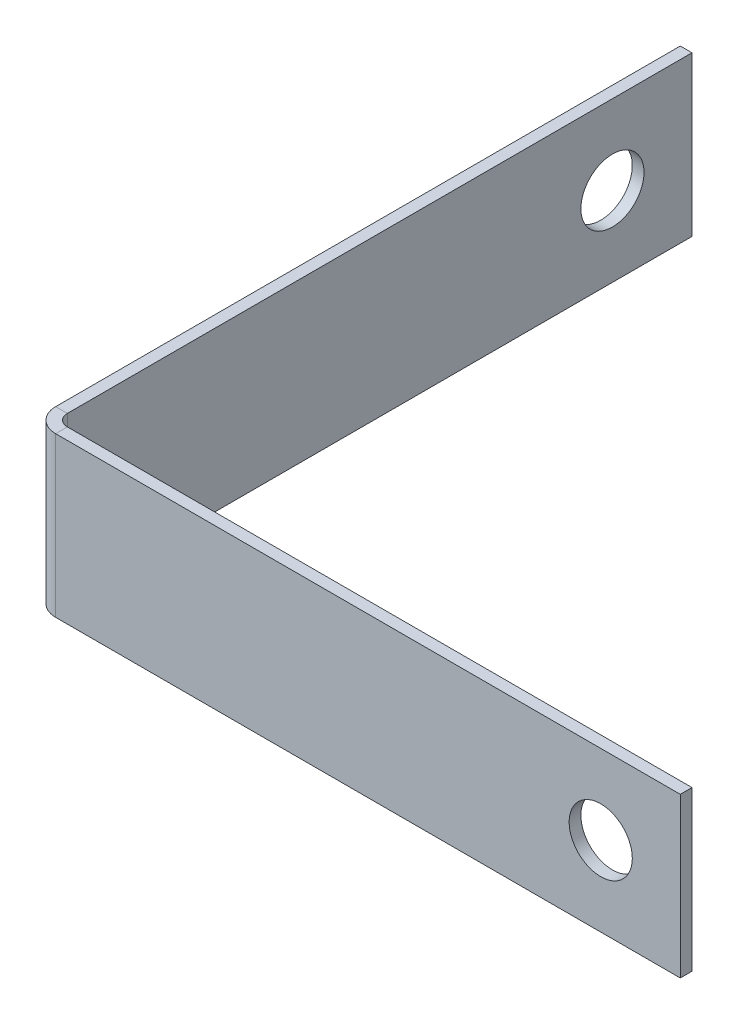
ISO-10303-21;
HEADER;
FILE_DESCRIPTION(('STEP AP214'),'2;1');
FILE_NAME('part.step','',(''),(''),'','','');
FILE_SCHEMA(('AUTOMOTIVE_DESIGN { 1 0 10303 214 1 1 1 1 }'));
ENDSEC;
DATA;
#1=APPLICATION_CONTEXT('core data for automotive mechanical design processes');
#2=APPLICATION_PROTOCOL_DEFINITION('international standard','automotive_design',2000,#1);
#3=PRODUCT_CONTEXT('',#1,'mechanical');
#4=PRODUCT('Part','Part','',(#3));
#5=PRODUCT_RELATED_PRODUCT_CATEGORY('part','',(#4));
#6=PRODUCT_DEFINITION_FORMATION('','',#4);
#7=PRODUCT_DEFINITION_CONTEXT('part definition',#1,'design');
#8=PRODUCT_DEFINITION('design','',#6,#7);
#9=PRODUCT_DEFINITION_SHAPE('','',#8);
#10=(LENGTH_UNIT() NAMED_UNIT(*) SI_UNIT(.MILLI.,.METRE.));
#11=(NAMED_UNIT(*) PLANE_ANGLE_UNIT() SI_UNIT($,.RADIAN.));
#12=(NAMED_UNIT(*) SI_UNIT($,.STERADIAN.) SOLID_ANGLE_UNIT());
#13=UNCERTAINTY_MEASURE_WITH_UNIT(LENGTH_MEASURE(1.E-05),#10,'distance_accuracy_value','');
#14=(GEOMETRIC_REPRESENTATION_CONTEXT(3) GLOBAL_UNCERTAINTY_ASSIGNED_CONTEXT((#13)) GLOBAL_UNIT_ASSIGNED_CONTEXT((#10,
#11,#12)) REPRESENTATION_CONTEXT('',''));
#15=CARTESIAN_POINT('',(0.,0.,0.));
#16=DIRECTION('',(0.,0.,1.));
#17=DIRECTION('',(1.,0.,0.));
#18=AXIS2_PLACEMENT_3D('',#15,#16,#17);
#19=CARTESIAN_POINT('',(0.736600000000004,10.,0.));
#20=DIRECTION('',(0.,1.,0.));
#21=DIRECTION('',(0.,0.,1.));
#22=AXIS2_PLACEMENT_3D('',#19,#20,#21);
#23=PLANE('',#22);
#24=DIRECTION('',(0.,0.,1.));
#25=VECTOR('',#24,1.);
#26=CARTESIAN_POINT('',(0.736600000000004,10.,0.));
#27=LINE('',#26,#25);
#28=CARTESIAN_POINT('',(0.736600000000004,10.,0.));
#29=VERTEX_POINT('',#28);
#30=CARTESIAN_POINT('',(0.736600000000004,10.,0.736600000000004));
#31=VERTEX_POINT('',#30);
#32=EDGE_CURVE('E11',#29,#31,#27,.T.);
#33=ORIENTED_EDGE('',*,*,#32,.F.);
#34=CARTESIAN_POINT('',(0.736600000000004,10.,-0.736600000000004));
#35=DIRECTION('',(0.,-1.,0.));
#36=DIRECTION('',(0.,0.,-1.));
#37=AXIS2_PLACEMENT_3D('',#34,#35,#36);
#38=CIRCLE('',#37,0.7366);
#39=CARTESIAN_POINT('',(0.,10.,-0.736600000000004));
#40=VERTEX_POINT('',#39);
#41=EDGE_CURVE('E136',#40,#29,#38,.F.);
#42=ORIENTED_EDGE('',*,*,#41,.F.);
#43=DIRECTION('',(1.,0.,0.));
#44=VECTOR('',#43,1.);
#45=CARTESIAN_POINT('',(-0.736600000000004,10.,-0.736600000000004));
#46=LINE('',#45,#44);
#47=CARTESIAN_POINT('',(-0.736600000000004,10.,-0.736600000000004));
#48=VERTEX_POINT('',#47);
#49=EDGE_CURVE('E47',#48,#40,#46,.T.);
#50=ORIENTED_EDGE('',*,*,#49,.F.);
#51=CARTESIAN_POINT('',(0.736600000000004,10.,-0.736600000000004));
#52=DIRECTION('',(0.,1.,0.));
#53=DIRECTION('',(1.,0.,0.));
#54=AXIS2_PLACEMENT_3D('',#51,#52,#53);
#55=CIRCLE('',#54,1.4732);
#56=EDGE_CURVE('E129',#48,#31,#55,.T.);
#57=ORIENTED_EDGE('',*,*,#56,.T.);
#58=EDGE_LOOP('',(#33,#42,#50,#57));
#59=FACE_BOUND('',#58,.T.);
#60=ADVANCED_FACE('F38',(#59),#23,.T.);
#61=CARTESIAN_POINT('',(-0.736600000000004,10.,-0.736600000000004));
#62=DIRECTION('',(0.,1.,0.));
#63=DIRECTION('',(0.,0.,1.));
#64=AXIS2_PLACEMENT_3D('',#61,#62,#63);
#65=PLANE('',#64);
#66=DIRECTION('',(1.,0.,0.));
#67=VECTOR('',#66,1.);
#68=CARTESIAN_POINT('',(0.,10.,0.));
#69=LINE('',#68,#67);
#70=CARTESIAN_POINT('',(40.,10.,0.));
#71=VERTEX_POINT('',#70);
#72=EDGE_CURVE('E186',#29,#71,#69,.T.);
#73=ORIENTED_EDGE('',*,*,#72,.F.);
#74=ORIENTED_EDGE('',*,*,#32,.T.);
#75=DIRECTION('',(1.,0.,0.));
#76=VECTOR('',#75,1.);
#77=CARTESIAN_POINT('',(0.,10.,0.736600000000004));
#78=LINE('',#77,#76);
#79=CARTESIAN_POINT('',(40.,10.,0.736600000000004));
#80=VERTEX_POINT('',#79);
#81=EDGE_CURVE('E95',#31,#80,#78,.T.);
#82=ORIENTED_EDGE('',*,*,#81,.T.);
#83=DIRECTION('',(0.,0.,1.));
#84=VECTOR('',#83,1.);
#85=CARTESIAN_POINT('',(40.,10.,0.));
#86=LINE('',#85,#84);
#87=EDGE_CURVE('E380',#71,#80,#86,.T.);
#88=ORIENTED_EDGE('',*,*,#87,.F.);
#89=EDGE_LOOP('',(#73,#74,#82,#88));
#90=FACE_BOUND('',#89,.T.);
#91=ADVANCED_FACE('F194',(#90),#65,.T.);
#92=CARTESIAN_POINT('',(0.,0.,-0.736600000000004));
#93=DIRECTION('',(0.,-1.,0.));
#94=DIRECTION('',(0.,0.,-1.));
#95=AXIS2_PLACEMENT_3D('',#92,#93,#94);
#96=PLANE('',#95);
#97=DIRECTION('',(-1.,0.,0.));
#98=VECTOR('',#97,1.);
#99=CARTESIAN_POINT('',(0.,0.,-0.736600000000004));
#100=LINE('',#99,#98);
#101=CARTESIAN_POINT('',(0.,0.,-0.736600000000004));
#102=VERTEX_POINT('',#101);
#103=CARTESIAN_POINT('',(-0.736600000000004,0.,-0.736600000000004));
#104=VERTEX_POINT('',#103);
#105=EDGE_CURVE('E82',#102,#104,#100,.T.);
#106=ORIENTED_EDGE('',*,*,#105,.F.);
#107=CARTESIAN_POINT('',(0.736600000000004,0.,-0.736600000000004));
#108=DIRECTION('',(0.,-1.,0.));
#109=DIRECTION('',(0.,0.,-1.));
#110=AXIS2_PLACEMENT_3D('',#107,#108,#109);
#111=CIRCLE('',#110,0.7366);
#112=CARTESIAN_POINT('',(0.736600000000004,0.,0.));
#113=VERTEX_POINT('',#112);
#114=EDGE_CURVE('E151',#102,#113,#111,.F.);
#115=ORIENTED_EDGE('',*,*,#114,.T.);
#116=DIRECTION('',(0.,0.,-1.));
#117=VECTOR('',#116,1.);
#118=CARTESIAN_POINT('',(0.736600000000004,0.,0.736600000000004));
#119=LINE('',#118,#117);
#120=CARTESIAN_POINT('',(0.736600000000004,0.,0.736600000000004));
#121=VERTEX_POINT('',#120);
#122=EDGE_CURVE('E89',#121,#113,#119,.T.);
#123=ORIENTED_EDGE('',*,*,#122,.F.);
#124=CARTESIAN_POINT('',(0.736600000000004,0.,-0.736600000000004));
#125=DIRECTION('',(0.,1.,0.));
#126=DIRECTION('',(1.,0.,0.));
#127=AXIS2_PLACEMENT_3D('',#124,#125,#126);
#128=CIRCLE('',#127,1.4732);
#129=EDGE_CURVE('E158',#104,#121,#128,.T.);
#130=ORIENTED_EDGE('',*,*,#129,.F.);
#131=EDGE_LOOP('',(#106,#115,#123,#130));
#132=FACE_BOUND('',#131,.T.);
#133=ADVANCED_FACE('F192',(#132),#96,.T.);
#134=CARTESIAN_POINT('',(0.736600000000004,0.,0.736600000000004));
#135=DIRECTION('',(0.,-1.,0.));
#136=DIRECTION('',(0.,0.,-1.));
#137=AXIS2_PLACEMENT_3D('',#134,#135,#136);
#138=PLANE('',#137);
#139=DIRECTION('',(0.,0.,1.));
#140=VECTOR('',#139,1.);
#141=CARTESIAN_POINT('',(0.,0.,-40.));
#142=LINE('',#141,#140);
#143=CARTESIAN_POINT('',(0.,0.,-40.));
#144=VERTEX_POINT('',#143);
#145=EDGE_CURVE('E153',#144,#102,#142,.T.);
#146=ORIENTED_EDGE('',*,*,#145,.T.);
#147=ORIENTED_EDGE('',*,*,#105,.T.);
#148=DIRECTION('',(0.,0.,1.));
#149=VECTOR('',#148,1.);
#150=CARTESIAN_POINT('',(-0.736600000000004,0.,-40.));
#151=LINE('',#150,#149);
#152=CARTESIAN_POINT('',(-0.736600000000004,0.,-40.));
#153=VERTEX_POINT('',#152);
#154=EDGE_CURVE('E156',#153,#104,#151,.T.);
#155=ORIENTED_EDGE('',*,*,#154,.F.);
#156=DIRECTION('',(1.,0.,0.));
#157=VECTOR('',#156,1.);
#158=CARTESIAN_POINT('',(-0.736600000000004,0.,-40.));
#159=LINE('',#158,#157);
#160=EDGE_CURVE('E117',#153,#144,#159,.T.);
#161=ORIENTED_EDGE('',*,*,#160,.T.);
#162=EDGE_LOOP('',(#146,#147,#155,#161));
#163=FACE_BOUND('',#162,.T.);
#164=ADVANCED_FACE('F188',(#163),#138,.T.);
#165=CARTESIAN_POINT('',(0.,10.,0.736600000000004));
#166=DIRECTION('',(0.,0.,-1.));
#167=DIRECTION('',(-1.,0.,0.));
#168=AXIS2_PLACEMENT_3D('',#165,#166,#167);
#169=PLANE('',#168);
#170=CARTESIAN_POINT('',(35.,5.,0.736600000000004));
#171=DIRECTION('',(0.,0.,1.));
#172=DIRECTION('',(1.,0.,0.));
#173=AXIS2_PLACEMENT_3D('',#170,#171,#172);
#174=CIRCLE('',#173,1.984375);
#175=CARTESIAN_POINT('',(36.984375,5.,0.736600000000004));
#176=VERTEX_POINT('',#175);
#177=EDGE_CURVE('E374',#176,#176,#174,.T.);
#178=ORIENTED_EDGE('',*,*,#177,.F.);
#179=EDGE_LOOP('',(#178));
#180=FACE_BOUND('',#179,.T.);
#181=DIRECTION('',(1.,0.,0.));
#182=VECTOR('',#181,1.);
#183=CARTESIAN_POINT('',(0.,0.,0.736600000000004));
#184=LINE('',#183,#182);
#185=CARTESIAN_POINT('',(40.,0.,0.736600000000004));
#186=VERTEX_POINT('',#185);
#187=EDGE_CURVE('E142',#121,#186,#184,.T.);
#188=ORIENTED_EDGE('',*,*,#187,.T.);
#189=DIRECTION('',(0.,-1.,0.));
#190=VECTOR('',#189,1.);
#191=CARTESIAN_POINT('',(40.,10.,0.736600000000004));
#192=LINE('',#191,#190);
#193=EDGE_CURVE('E172',#80,#186,#192,.T.);
#194=ORIENTED_EDGE('',*,*,#193,.F.);
#195=ORIENTED_EDGE('',*,*,#81,.F.);
#196=DIRECTION('',(0.,-1.,0.));
#197=VECTOR('',#196,1.);
#198=CARTESIAN_POINT('',(0.736600000000004,10.,0.736600000000004));
#199=LINE('',#198,#197);
#200=EDGE_CURVE('E141',#31,#121,#199,.T.);
#201=ORIENTED_EDGE('',*,*,#200,.T.);
#202=EDGE_LOOP('',(#188,#194,#195,#201));
#203=FACE_BOUND('',#202,.T.);
#204=ADVANCED_FACE('F200',(#180,#203),#169,.F.);
#205=CARTESIAN_POINT('',(40.,10.,0.));
#206=DIRECTION('',(1.,0.,0.));
#207=DIRECTION('',(0.,0.,-1.));
#208=AXIS2_PLACEMENT_3D('',#205,#206,#207);
#209=PLANE('',#208);
#210=DIRECTION('',(0.,0.,1.));
#211=VECTOR('',#210,1.);
#212=CARTESIAN_POINT('',(40.,0.,0.));
#213=LINE('',#212,#211);
#214=CARTESIAN_POINT('',(40.,0.,0.));
#215=VERTEX_POINT('',#214);
#216=EDGE_CURVE('E145',#215,#186,#213,.T.);
#217=ORIENTED_EDGE('',*,*,#216,.F.);
#218=DIRECTION('',(0.,-1.,0.));
#219=VECTOR('',#218,1.);
#220=CARTESIAN_POINT('',(40.,10.,0.));
#221=LINE('',#220,#219);
#222=EDGE_CURVE('E170',#71,#215,#221,.T.);
#223=ORIENTED_EDGE('',*,*,#222,.F.);
#224=ORIENTED_EDGE('',*,*,#87,.T.);
#225=ORIENTED_EDGE('',*,*,#193,.T.);
#226=EDGE_LOOP('',(#217,#223,#224,#225));
#227=FACE_BOUND('',#226,.T.);
#228=ADVANCED_FACE('F231',(#227),#209,.T.);
#229=CARTESIAN_POINT('',(0.,10.,0.));
#230=DIRECTION('',(0.,0.,-1.));
#231=DIRECTION('',(-1.,0.,0.));
#232=AXIS2_PLACEMENT_3D('',#229,#230,#231);
#233=PLANE('',#232);
#234=CARTESIAN_POINT('',(35.,5.,0.));
#235=DIRECTION('',(0.,0.,-1.));
#236=DIRECTION('',(-1.,0.,0.));
#237=AXIS2_PLACEMENT_3D('',#234,#235,#236);
#238=CIRCLE('',#237,1.984375);
#239=CARTESIAN_POINT('',(33.015625,5.,0.));
#240=VERTEX_POINT('',#239);
#241=EDGE_CURVE('E41',#240,#240,#238,.T.);
#242=ORIENTED_EDGE('',*,*,#241,.F.);
#243=EDGE_LOOP('',(#242));
#244=FACE_BOUND('',#243,.T.);
#245=DIRECTION('',(1.,0.,0.));
#246=VECTOR('',#245,1.);
#247=CARTESIAN_POINT('',(0.,0.,0.));
#248=LINE('',#247,#246);
#249=EDGE_CURVE('E148',#113,#215,#248,.T.);
#250=ORIENTED_EDGE('',*,*,#249,.F.);
#251=DIRECTION('',(0.,-1.,0.));
#252=VECTOR('',#251,1.);
#253=CARTESIAN_POINT('',(0.736600000000004,10.,0.));
#254=LINE('',#253,#252);
#255=EDGE_CURVE('E167',#29,#113,#254,.T.);
#256=ORIENTED_EDGE('',*,*,#255,.F.);
#257=ORIENTED_EDGE('',*,*,#72,.T.);
#258=ORIENTED_EDGE('',*,*,#222,.T.);
#259=EDGE_LOOP('',(#250,#256,#257,#258));
#260=FACE_BOUND('',#259,.T.);
#261=ADVANCED_FACE('F242',(#244,#260),#233,.T.);
#262=CARTESIAN_POINT('',(0.736600000000004,10.,-0.736600000000004));
#263=DIRECTION('',(0.,-1.,0.));
#264=DIRECTION('',(0.,0.,-1.));
#265=AXIS2_PLACEMENT_3D('',#262,#263,#264);
#266=CYLINDRICAL_SURFACE('',#265,0.7366);
#267=ORIENTED_EDGE('',*,*,#114,.F.);
#268=DIRECTION('',(0.,-1.,0.));
#269=VECTOR('',#268,1.);
#270=CARTESIAN_POINT('',(0.,10.,-0.736600000000004));
#271=LINE('',#270,#269);
#272=EDGE_CURVE('E164',#40,#102,#271,.T.);
#273=ORIENTED_EDGE('',*,*,#272,.F.);
#274=ORIENTED_EDGE('',*,*,#41,.T.);
#275=ORIENTED_EDGE('',*,*,#255,.T.);
#276=EDGE_LOOP('',(#267,#273,#274,#275));
#277=FACE_BOUND('',#276,.T.);
#278=ADVANCED_FACE('F182',(#277),#266,.F.);
#279=CARTESIAN_POINT('',(0.,10.,-40.));
#280=DIRECTION('',(1.,0.,0.));
#281=DIRECTION('',(0.,0.,-1.));
#282=AXIS2_PLACEMENT_3D('',#279,#280,#281);
#283=PLANE('',#282);
#284=CARTESIAN_POINT('',(0.,5.,-35.));
#285=DIRECTION('',(1.,0.,0.));
#286=DIRECTION('',(0.,0.,-1.));
#287=AXIS2_PLACEMENT_3D('',#284,#285,#286);
#288=CIRCLE('',#287,1.984375);
#289=CARTESIAN_POINT('',(0.,5.,-36.984375));
#290=VERTEX_POINT('',#289);
#291=EDGE_CURVE('E369',#290,#290,#288,.T.);
#292=ORIENTED_EDGE('',*,*,#291,.F.);
#293=EDGE_LOOP('',(#292));
#294=FACE_BOUND('',#293,.T.);
#295=ORIENTED_EDGE('',*,*,#145,.F.);
#296=DIRECTION('',(0.,-1.,0.));
#297=VECTOR('',#296,1.);
#298=CARTESIAN_POINT('',(0.,10.,-40.));
#299=LINE('',#298,#297);
#300=CARTESIAN_POINT('',(0.,10.,-40.));
#301=VERTEX_POINT('',#300);
#302=EDGE_CURVE('E119',#301,#144,#299,.T.);
#303=ORIENTED_EDGE('',*,*,#302,.F.);
#304=DIRECTION('',(0.,0.,1.));
#305=VECTOR('',#304,1.);
#306=CARTESIAN_POINT('',(0.,10.,-40.));
#307=LINE('',#306,#305);
#308=EDGE_CURVE('E134',#301,#40,#307,.T.);
#309=ORIENTED_EDGE('',*,*,#308,.T.);
#310=ORIENTED_EDGE('',*,*,#272,.T.);
#311=EDGE_LOOP('',(#295,#303,#309,#310));
#312=FACE_BOUND('',#311,.T.);
#313=ADVANCED_FACE('F187',(#294,#312),#283,.T.);
#314=CARTESIAN_POINT('',(-0.736600000000004,10.,-40.));
#315=DIRECTION('',(0.,0.,-1.));
#316=DIRECTION('',(-1.,0.,0.));
#317=AXIS2_PLACEMENT_3D('',#314,#315,#316);
#318=PLANE('',#317);
#319=ORIENTED_EDGE('',*,*,#160,.F.);
#320=DIRECTION('',(0.,-1.,0.));
#321=VECTOR('',#320,1.);
#322=CARTESIAN_POINT('',(-0.736600000000004,10.,-40.));
#323=LINE('',#322,#321);
#324=CARTESIAN_POINT('',(-0.736600000000004,10.,-40.));
#325=VERTEX_POINT('',#324);
#326=EDGE_CURVE('E111',#325,#153,#323,.T.);
#327=ORIENTED_EDGE('',*,*,#326,.F.);
#328=DIRECTION('',(1.,0.,0.));
#329=VECTOR('',#328,1.);
#330=CARTESIAN_POINT('',(-0.736600000000004,10.,-40.));
#331=LINE('',#330,#329);
#332=EDGE_CURVE('E115',#325,#301,#331,.T.);
#333=ORIENTED_EDGE('',*,*,#332,.T.);
#334=ORIENTED_EDGE('',*,*,#302,.T.);
#335=EDGE_LOOP('',(#319,#327,#333,#334));
#336=FACE_BOUND('',#335,.T.);
#337=ADVANCED_FACE('F113',(#336),#318,.T.);
#338=CARTESIAN_POINT('',(-0.736600000000004,10.,-40.));
#339=DIRECTION('',(1.,0.,0.));
#340=DIRECTION('',(0.,0.,-1.));
#341=AXIS2_PLACEMENT_3D('',#338,#339,#340);
#342=PLANE('',#341);
#343=CARTESIAN_POINT('',(-0.736600000000004,4.99999999999995,-35.));
#344=DIRECTION('',(-1.,0.,0.));
#345=DIRECTION('',(0.,0.,1.));
#346=AXIS2_PLACEMENT_3D('',#343,#344,#345);
#347=CIRCLE('',#346,1.984375);
#348=CARTESIAN_POINT('',(-0.736600000000004,4.99999999999995,-33.015625));
#349=VERTEX_POINT('',#348);
#350=EDGE_CURVE('E372',#349,#349,#347,.T.);
#351=ORIENTED_EDGE('',*,*,#350,.F.);
#352=EDGE_LOOP('',(#351));
#353=FACE_BOUND('',#352,.T.);
#354=ORIENTED_EDGE('',*,*,#154,.T.);
#355=DIRECTION('',(0.,-1.,0.));
#356=VECTOR('',#355,1.);
#357=CARTESIAN_POINT('',(-0.736600000000004,10.,-0.736600000000004));
#358=LINE('',#357,#356);
#359=EDGE_CURVE('E120',#48,#104,#358,.T.);
#360=ORIENTED_EDGE('',*,*,#359,.F.);
#361=DIRECTION('',(0.,0.,1.));
#362=VECTOR('',#361,1.);
#363=CARTESIAN_POINT('',(-0.736600000000004,10.,-40.));
#364=LINE('',#363,#362);
#365=EDGE_CURVE('E124',#325,#48,#364,.T.);
#366=ORIENTED_EDGE('',*,*,#365,.F.);
#367=ORIENTED_EDGE('',*,*,#326,.T.);
#368=EDGE_LOOP('',(#354,#360,#366,#367));
#369=FACE_BOUND('',#368,.T.);
#370=ADVANCED_FACE('F125',(#353,#369),#342,.F.);
#371=CARTESIAN_POINT('',(0.736600000000004,10.,-0.736600000000004));
#372=DIRECTION('',(0.,-1.,0.));
#373=DIRECTION('',(0.,0.,-1.));
#374=AXIS2_PLACEMENT_3D('',#371,#372,#373);
#375=CYLINDRICAL_SURFACE('',#374,1.4732);
#376=ORIENTED_EDGE('',*,*,#129,.T.);
#377=ORIENTED_EDGE('',*,*,#200,.F.);
#378=ORIENTED_EDGE('',*,*,#56,.F.);
#379=ORIENTED_EDGE('',*,*,#359,.T.);
#380=EDGE_LOOP('',(#376,#377,#378,#379));
#381=FACE_BOUND('',#380,.T.);
#382=ADVANCED_FACE('F190',(#381),#375,.T.);
#383=CARTESIAN_POINT('',(0.736600000000004,10.,-0.736600000000004));
#384=DIRECTION('',(0.,-1.,0.));
#385=DIRECTION('',(-1.,0.,0.));
#386=AXIS2_PLACEMENT_3D('',#383,#384,#385);
#387=PLANE('',#386);
#388=ORIENTED_EDGE('',*,*,#365,.T.);
#389=ORIENTED_EDGE('',*,*,#49,.T.);
#390=ORIENTED_EDGE('',*,*,#308,.F.);
#391=ORIENTED_EDGE('',*,*,#332,.F.);
#392=EDGE_LOOP('',(#388,#389,#390,#391));
#393=FACE_BOUND('',#392,.T.);
#394=ADVANCED_FACE('F132',(#393),#387,.F.);
#395=CARTESIAN_POINT('',(0.736600000000004,0.,-0.736600000000004));
#396=DIRECTION('',(0.,-1.,0.));
#397=DIRECTION('',(-1.,0.,0.));
#398=AXIS2_PLACEMENT_3D('',#395,#396,#397);
#399=PLANE('',#398);
#400=ORIENTED_EDGE('',*,*,#187,.F.);
#401=ORIENTED_EDGE('',*,*,#122,.T.);
#402=ORIENTED_EDGE('',*,*,#249,.T.);
#403=ORIENTED_EDGE('',*,*,#216,.T.);
#404=EDGE_LOOP('',(#400,#401,#402,#403));
#405=FACE_BOUND('',#404,.T.);
#406=ADVANCED_FACE('F310',(#405),#399,.T.);
#407=CARTESIAN_POINT('',(35.,5.,-9.2634));
#408=DIRECTION('',(0.,0.,1.));
#409=DIRECTION('',(1.,0.,0.));
#410=AXIS2_PLACEMENT_3D('',#407,#408,#409);
#411=CYLINDRICAL_SURFACE('',#410,1.984375);
#412=ORIENTED_EDGE('',*,*,#241,.T.);
#413=EDGE_LOOP('',(#412));
#414=FACE_BOUND('',#413,.T.);
#415=ORIENTED_EDGE('',*,*,#177,.T.);
#416=EDGE_LOOP('',(#415));
#417=FACE_BOUND('',#416,.T.);
#418=ADVANCED_FACE('F320',(#414,#417),#411,.F.);
#419=CARTESIAN_POINT('',(9.2634,5.,-35.));
#420=DIRECTION('',(-1.,0.,0.));
#421=DIRECTION('',(0.,0.,1.));
#422=AXIS2_PLACEMENT_3D('',#419,#420,#421);
#423=CYLINDRICAL_SURFACE('',#422,1.984375);
#424=ORIENTED_EDGE('',*,*,#291,.T.);
#425=EDGE_LOOP('',(#424));
#426=FACE_BOUND('',#425,.T.);
#427=ORIENTED_EDGE('',*,*,#350,.T.);
#428=EDGE_LOOP('',(#427));
#429=FACE_BOUND('',#428,.T.);
#430=ADVANCED_FACE('F331',(#426,#429),#423,.F.);
#431=CLOSED_SHELL('',(#60,#91,#133,#164,#204,#228,#261,#278,#313,#337,#370,#382,#394,#406,#418,#430));
#432=MANIFOLD_SOLID_BREP('B2',#431);
#433=ADVANCED_BREP_SHAPE_REPRESENTATION('',(#18,#432),#14);
#434=SHAPE_DEFINITION_REPRESENTATION(#9,#433);
ENDSEC;
END-ISO-10303-21;
